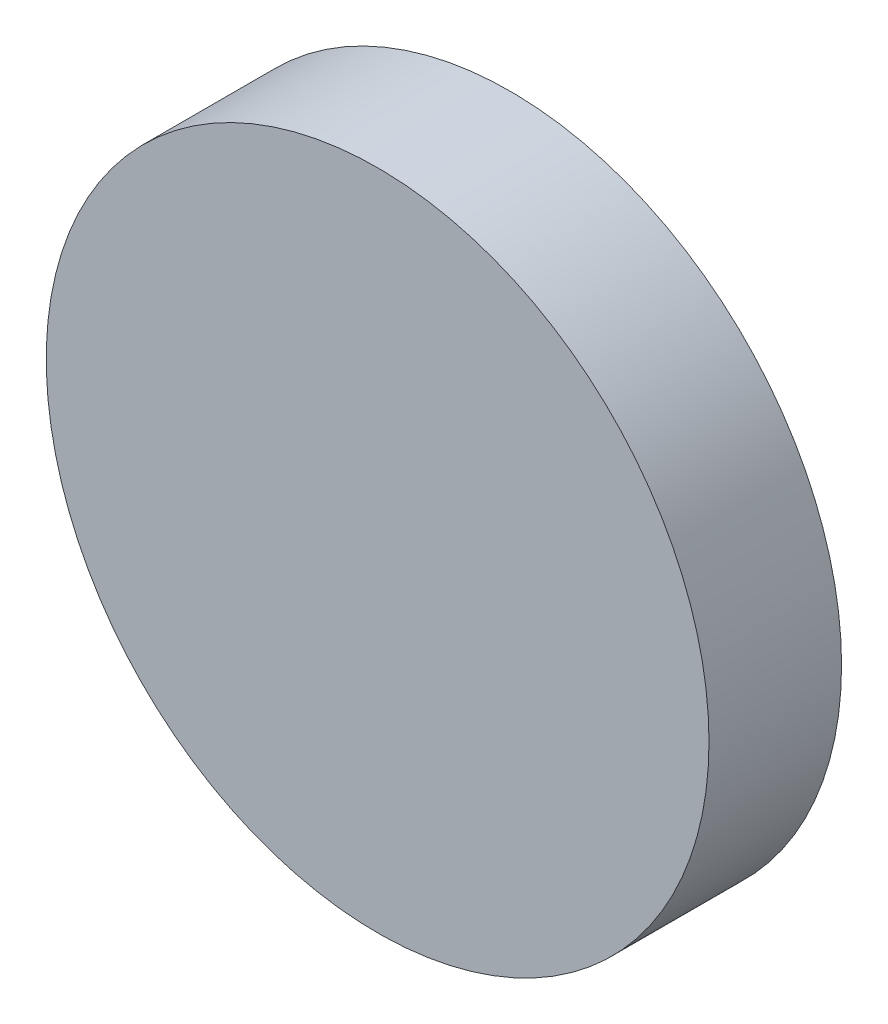
ISO-10303-21;
HEADER;
FILE_DESCRIPTION(('STEP AP214'),'2;1');
FILE_NAME('part.step','',(''),(''),'','','');
FILE_SCHEMA(('AUTOMOTIVE_DESIGN { 1 0 10303 214 1 1 1 1 }'));
ENDSEC;
DATA;
#1=APPLICATION_CONTEXT('core data for automotive mechanical design processes');
#2=APPLICATION_PROTOCOL_DEFINITION('international standard','automotive_design',2000,#1);
#3=PRODUCT_CONTEXT('',#1,'mechanical');
#4=PRODUCT('Part','Part','',(#3));
#5=PRODUCT_RELATED_PRODUCT_CATEGORY('part','',(#4));
#6=PRODUCT_DEFINITION_FORMATION('','',#4);
#7=PRODUCT_DEFINITION_CONTEXT('part definition',#1,'design');
#8=PRODUCT_DEFINITION('design','',#6,#7);
#9=PRODUCT_DEFINITION_SHAPE('','',#8);
#10=(LENGTH_UNIT() NAMED_UNIT(*) SI_UNIT(.MILLI.,.METRE.));
#11=(NAMED_UNIT(*) PLANE_ANGLE_UNIT() SI_UNIT($,.RADIAN.));
#12=(NAMED_UNIT(*) SI_UNIT($,.STERADIAN.) SOLID_ANGLE_UNIT());
#13=UNCERTAINTY_MEASURE_WITH_UNIT(LENGTH_MEASURE(1.E-05),#10,'distance_accuracy_value','');
#14=(GEOMETRIC_REPRESENTATION_CONTEXT(3) GLOBAL_UNCERTAINTY_ASSIGNED_CONTEXT((#13)) GLOBAL_UNIT_ASSIGNED_CONTEXT((#10,
#11,#12)) REPRESENTATION_CONTEXT('',''));
#15=CARTESIAN_POINT('',(0.,0.,0.));
#16=DIRECTION('',(0.,0.,1.));
#17=DIRECTION('',(1.,0.,0.));
#18=AXIS2_PLACEMENT_3D('',#15,#16,#17);
#19=CARTESIAN_POINT('',(0.,0.,5.));
#20=DIRECTION('',(0.,0.,-1.));
#21=DIRECTION('',(-1.,0.,0.));
#22=AXIS2_PLACEMENT_3D('',#19,#20,#21);
#23=CYLINDRICAL_SURFACE('',#22,12.5);
#24=CARTESIAN_POINT('',(0.,0.,5.));
#25=DIRECTION('',(0.,0.,1.));
#26=DIRECTION('',(1.,0.,0.));
#27=AXIS2_PLACEMENT_3D('',#24,#25,#26);
#28=CIRCLE('',#27,12.5);
#29=CARTESIAN_POINT('',(12.5,0.,5.));
#30=VERTEX_POINT('',#29);
#31=EDGE_CURVE('E10',#30,#30,#28,.T.);
#32=ORIENTED_EDGE('',*,*,#31,.F.);
#33=EDGE_LOOP('',(#32));
#34=FACE_BOUND('',#33,.T.);
#35=CARTESIAN_POINT('',(0.,0.,0.));
#36=DIRECTION('',(0.,0.,1.));
#37=DIRECTION('',(1.,0.,0.));
#38=AXIS2_PLACEMENT_3D('',#35,#36,#37);
#39=CIRCLE('',#38,12.5);
#40=CARTESIAN_POINT('',(12.5,0.,0.));
#41=VERTEX_POINT('',#40);
#42=EDGE_CURVE('E34',#41,#41,#39,.T.);
#43=ORIENTED_EDGE('',*,*,#42,.T.);
#44=EDGE_LOOP('',(#43));
#45=FACE_BOUND('',#44,.T.);
#46=ADVANCED_FACE('F31',(#34,#45),#23,.T.);
#47=CARTESIAN_POINT('',(0.,0.,5.));
#48=DIRECTION('',(0.,0.,1.));
#49=DIRECTION('',(1.,0.,0.));
#50=AXIS2_PLACEMENT_3D('',#47,#48,#49);
#51=PLANE('',#50);
#52=ORIENTED_EDGE('',*,*,#31,.T.);
#53=EDGE_LOOP('',(#52));
#54=FACE_BOUND('',#53,.T.);
#55=ADVANCED_FACE('F46',(#54),#51,.T.);
#56=CARTESIAN_POINT('',(0.,0.,0.));
#57=DIRECTION('',(0.,0.,1.));
#58=DIRECTION('',(1.,0.,0.));
#59=AXIS2_PLACEMENT_3D('',#56,#57,#58);
#60=PLANE('',#59);
#61=ORIENTED_EDGE('',*,*,#42,.F.);
#62=EDGE_LOOP('',(#61));
#63=FACE_BOUND('',#62,.T.);
#64=ADVANCED_FACE('F44',(#63),#60,.F.);
#65=CLOSED_SHELL('',(#46,#55,#64));
#66=MANIFOLD_SOLID_BREP('B2',#65);
#67=ADVANCED_BREP_SHAPE_REPRESENTATION('',(#18,#66),#14);
#68=SHAPE_DEFINITION_REPRESENTATION(#9,#67);
ENDSEC;
END-ISO-10303-21;
